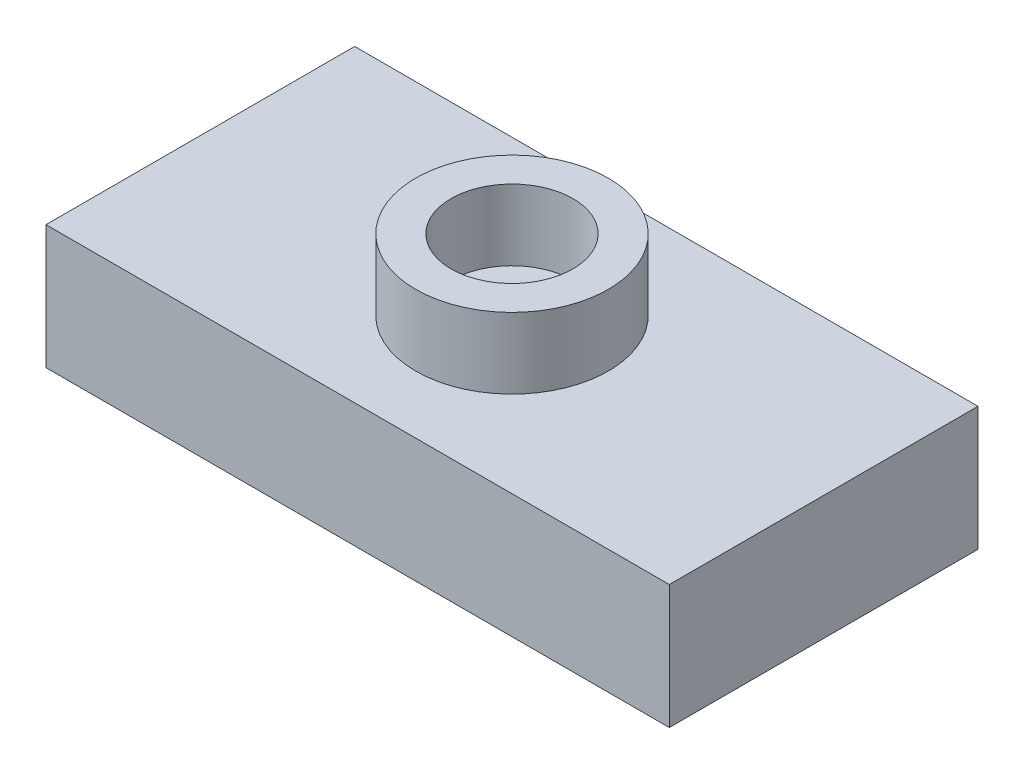
ISO-10303-21;
HEADER;
FILE_DESCRIPTION(('STEP AP214'),'2;1');
FILE_NAME('part.step','',(''),(''),'','','');
FILE_SCHEMA(('AUTOMOTIVE_DESIGN { 1 0 10303 214 1 1 1 1 }'));
ENDSEC;
DATA;
#1=APPLICATION_CONTEXT('core data for automotive mechanical design processes');
#2=APPLICATION_PROTOCOL_DEFINITION('international standard','automotive_design',2000,#1);
#3=PRODUCT_CONTEXT('',#1,'mechanical');
#4=PRODUCT('Part','Part','',(#3));
#5=PRODUCT_RELATED_PRODUCT_CATEGORY('part','',(#4));
#6=PRODUCT_DEFINITION_FORMATION('','',#4);
#7=PRODUCT_DEFINITION_CONTEXT('part definition',#1,'design');
#8=PRODUCT_DEFINITION('design','',#6,#7);
#9=PRODUCT_DEFINITION_SHAPE('','',#8);
#10=(LENGTH_UNIT() NAMED_UNIT(*) SI_UNIT(.MILLI.,.METRE.));
#11=(NAMED_UNIT(*) PLANE_ANGLE_UNIT() SI_UNIT($,.RADIAN.));
#12=(NAMED_UNIT(*) SI_UNIT($,.STERADIAN.) SOLID_ANGLE_UNIT());
#13=UNCERTAINTY_MEASURE_WITH_UNIT(LENGTH_MEASURE(1.E-05),#10,'distance_accuracy_value','');
#14=(GEOMETRIC_REPRESENTATION_CONTEXT(3) GLOBAL_UNCERTAINTY_ASSIGNED_CONTEXT((#13)) GLOBAL_UNIT_ASSIGNED_CONTEXT((#10,
#11,#12)) REPRESENTATION_CONTEXT('',''));
#15=CARTESIAN_POINT('',(0.,0.,0.));
#16=DIRECTION('',(0.,0.,1.));
#17=DIRECTION('',(1.,0.,0.));
#18=AXIS2_PLACEMENT_3D('',#15,#16,#17);
#19=CARTESIAN_POINT('',(7.925,-3.15,-3.925));
#20=DIRECTION('',(1.,0.,0.));
#21=DIRECTION('',(0.,0.,-1.));
#22=AXIS2_PLACEMENT_3D('',#19,#20,#21);
#23=PLANE('',#22);
#24=DIRECTION('',(0.,0.,-1.));
#25=VECTOR('',#24,1.);
#26=CARTESIAN_POINT('',(7.925,0.,-3.925));
#27=LINE('',#26,#25);
#28=CARTESIAN_POINT('',(7.925,0.,3.925));
#29=VERTEX_POINT('',#28);
#30=CARTESIAN_POINT('',(7.925,0.,-3.925));
#31=VERTEX_POINT('',#30);
#32=EDGE_CURVE('E115',#29,#31,#27,.T.);
#33=ORIENTED_EDGE('',*,*,#32,.F.);
#34=DIRECTION('',(0.,1.,0.));
#35=VECTOR('',#34,1.);
#36=CARTESIAN_POINT('',(7.925,-3.15,3.925));
#37=LINE('',#36,#35);
#38=CARTESIAN_POINT('',(7.925,-3.15,3.925));
#39=VERTEX_POINT('',#38);
#40=EDGE_CURVE('E40',#39,#29,#37,.T.);
#41=ORIENTED_EDGE('',*,*,#40,.F.);
#42=DIRECTION('',(0.,0.,-1.));
#43=VECTOR('',#42,1.);
#44=CARTESIAN_POINT('',(7.925,-3.15,-3.925));
#45=LINE('',#44,#43);
#46=CARTESIAN_POINT('',(7.925,-3.15,-3.925));
#47=VERTEX_POINT('',#46);
#48=EDGE_CURVE('E147',#39,#47,#45,.T.);
#49=ORIENTED_EDGE('',*,*,#48,.T.);
#50=DIRECTION('',(0.,1.,0.));
#51=VECTOR('',#50,1.);
#52=CARTESIAN_POINT('',(7.925,-3.15,-3.925));
#53=LINE('',#52,#51);
#54=EDGE_CURVE('E81',#47,#31,#53,.T.);
#55=ORIENTED_EDGE('',*,*,#54,.T.);
#56=EDGE_LOOP('',(#33,#41,#49,#55));
#57=FACE_BOUND('',#56,.T.);
#58=ADVANCED_FACE('F33',(#57),#23,.T.);
#59=CARTESIAN_POINT('',(-7.925,-3.15,3.925));
#60=DIRECTION('',(0.,0.,1.));
#61=DIRECTION('',(1.,0.,0.));
#62=AXIS2_PLACEMENT_3D('',#59,#60,#61);
#63=PLANE('',#62);
#64=DIRECTION('',(1.,0.,0.));
#65=VECTOR('',#64,1.);
#66=CARTESIAN_POINT('',(-7.925,0.,3.925));
#67=LINE('',#66,#65);
#68=CARTESIAN_POINT('',(-7.925,0.,3.925));
#69=VERTEX_POINT('',#68);
#70=EDGE_CURVE('E150',#69,#29,#67,.T.);
#71=ORIENTED_EDGE('',*,*,#70,.F.);
#72=DIRECTION('',(0.,1.,0.));
#73=VECTOR('',#72,1.);
#74=CARTESIAN_POINT('',(-7.925,-3.15,3.925));
#75=LINE('',#74,#73);
#76=CARTESIAN_POINT('',(-7.925,-3.15,3.925));
#77=VERTEX_POINT('',#76);
#78=EDGE_CURVE('E168',#77,#69,#75,.T.);
#79=ORIENTED_EDGE('',*,*,#78,.F.);
#80=DIRECTION('',(1.,0.,0.));
#81=VECTOR('',#80,1.);
#82=CARTESIAN_POINT('',(-7.925,-3.15,3.925));
#83=LINE('',#82,#81);
#84=EDGE_CURVE('E155',#77,#39,#83,.T.);
#85=ORIENTED_EDGE('',*,*,#84,.T.);
#86=ORIENTED_EDGE('',*,*,#40,.T.);
#87=EDGE_LOOP('',(#71,#79,#85,#86));
#88=FACE_BOUND('',#87,.T.);
#89=ADVANCED_FACE('F175',(#88),#63,.T.);
#90=CARTESIAN_POINT('',(-7.925,-3.15,-3.925));
#91=DIRECTION('',(-1.,0.,0.));
#92=DIRECTION('',(0.,0.,1.));
#93=AXIS2_PLACEMENT_3D('',#90,#91,#92);
#94=PLANE('',#93);
#95=DIRECTION('',(0.,0.,1.));
#96=VECTOR('',#95,1.);
#97=CARTESIAN_POINT('',(-7.925,0.,-3.925));
#98=LINE('',#97,#96);
#99=CARTESIAN_POINT('',(-7.925,0.,-3.925));
#100=VERTEX_POINT('',#99);
#101=EDGE_CURVE('E162',#100,#69,#98,.T.);
#102=ORIENTED_EDGE('',*,*,#101,.F.);
#103=DIRECTION('',(0.,1.,0.));
#104=VECTOR('',#103,1.);
#105=CARTESIAN_POINT('',(-7.925,-3.15,-3.925));
#106=LINE('',#105,#104);
#107=CARTESIAN_POINT('',(-7.925,-3.15,-3.925));
#108=VERTEX_POINT('',#107);
#109=EDGE_CURVE('E170',#108,#100,#106,.T.);
#110=ORIENTED_EDGE('',*,*,#109,.F.);
#111=DIRECTION('',(0.,0.,1.));
#112=VECTOR('',#111,1.);
#113=CARTESIAN_POINT('',(-7.925,-3.15,-3.925));
#114=LINE('',#113,#112);
#115=EDGE_CURVE('E152',#108,#77,#114,.T.);
#116=ORIENTED_EDGE('',*,*,#115,.T.);
#117=ORIENTED_EDGE('',*,*,#78,.T.);
#118=EDGE_LOOP('',(#102,#110,#116,#117));
#119=FACE_BOUND('',#118,.T.);
#120=ADVANCED_FACE('F179',(#119),#94,.T.);
#121=CARTESIAN_POINT('',(-7.925,-3.15,-3.925));
#122=DIRECTION('',(0.,0.,-1.));
#123=DIRECTION('',(-1.,0.,0.));
#124=AXIS2_PLACEMENT_3D('',#121,#122,#123);
#125=PLANE('',#124);
#126=DIRECTION('',(-1.,0.,0.));
#127=VECTOR('',#126,1.);
#128=CARTESIAN_POINT('',(-7.925,0.,-3.925));
#129=LINE('',#128,#127);
#130=EDGE_CURVE('E159',#31,#100,#129,.T.);
#131=ORIENTED_EDGE('',*,*,#130,.F.);
#132=ORIENTED_EDGE('',*,*,#54,.F.);
#133=DIRECTION('',(-1.,0.,0.));
#134=VECTOR('',#133,1.);
#135=CARTESIAN_POINT('',(-7.925,-3.15,-3.925));
#136=LINE('',#135,#134);
#137=EDGE_CURVE('E149',#47,#108,#136,.T.);
#138=ORIENTED_EDGE('',*,*,#137,.T.);
#139=ORIENTED_EDGE('',*,*,#109,.T.);
#140=EDGE_LOOP('',(#131,#132,#138,#139));
#141=FACE_BOUND('',#140,.T.);
#142=ADVANCED_FACE('F171',(#141),#125,.T.);
#143=CARTESIAN_POINT('',(0.,-3.15,0.));
#144=DIRECTION('',(0.,1.,0.));
#145=DIRECTION('',(0.,0.,1.));
#146=AXIS2_PLACEMENT_3D('',#143,#144,#145);
#147=PLANE('',#146);
#148=DIRECTION('',(1.,0.,0.));
#149=VECTOR('',#148,1.);
#150=CARTESIAN_POINT('',(0.,-3.15,2.425));
#151=LINE('',#150,#149);
#152=CARTESIAN_POINT('',(-6.425,-3.15,2.425));
#153=VERTEX_POINT('',#152);
#154=CARTESIAN_POINT('',(6.425,-3.15,2.425));
#155=VERTEX_POINT('',#154);
#156=EDGE_CURVE('E142',#153,#155,#151,.T.);
#157=ORIENTED_EDGE('',*,*,#156,.T.);
#158=DIRECTION('',(0.,0.,-1.));
#159=VECTOR('',#158,1.);
#160=CARTESIAN_POINT('',(6.425,-3.15,0.));
#161=LINE('',#160,#159);
#162=CARTESIAN_POINT('',(6.425,-3.15,-2.425));
#163=VERTEX_POINT('',#162);
#164=EDGE_CURVE('E110',#155,#163,#161,.T.);
#165=ORIENTED_EDGE('',*,*,#164,.T.);
#166=DIRECTION('',(-1.,0.,0.));
#167=VECTOR('',#166,1.);
#168=CARTESIAN_POINT('',(0.,-3.15,-2.425));
#169=LINE('',#168,#167);
#170=CARTESIAN_POINT('',(-6.425,-3.15,-2.425));
#171=VERTEX_POINT('',#170);
#172=EDGE_CURVE('E132',#163,#171,#169,.T.);
#173=ORIENTED_EDGE('',*,*,#172,.T.);
#174=DIRECTION('',(0.,0.,1.));
#175=VECTOR('',#174,1.);
#176=CARTESIAN_POINT('',(-6.425,-3.15,0.));
#177=LINE('',#176,#175);
#178=EDGE_CURVE('E47',#171,#153,#177,.T.);
#179=ORIENTED_EDGE('',*,*,#178,.T.);
#180=EDGE_LOOP('',(#157,#165,#173,#179));
#181=FACE_BOUND('',#180,.T.);
#182=ORIENTED_EDGE('',*,*,#48,.F.);
#183=ORIENTED_EDGE('',*,*,#84,.F.);
#184=ORIENTED_EDGE('',*,*,#115,.F.);
#185=ORIENTED_EDGE('',*,*,#137,.F.);
#186=EDGE_LOOP('',(#182,#183,#184,#185));
#187=FACE_BOUND('',#186,.T.);
#188=ADVANCED_FACE('F181',(#181,#187),#147,.F.);
#189=CARTESIAN_POINT('',(0.,0.,0.));
#190=DIRECTION('',(0.,1.,0.));
#191=DIRECTION('',(0.,0.,1.));
#192=AXIS2_PLACEMENT_3D('',#189,#190,#191);
#193=PLANE('',#192);
#194=CARTESIAN_POINT('',(0.,0.,0.));
#195=DIRECTION('',(0.,1.,0.));
#196=DIRECTION('',(0.,0.,1.));
#197=AXIS2_PLACEMENT_3D('',#194,#195,#196);
#198=CIRCLE('',#197,2.45);
#199=CARTESIAN_POINT('',(0.,0.,2.45));
#200=VERTEX_POINT('',#199);
#201=EDGE_CURVE('E308',#200,#200,#198,.T.);
#202=ORIENTED_EDGE('',*,*,#201,.F.);
#203=EDGE_LOOP('',(#202));
#204=FACE_BOUND('',#203,.T.);
#205=ORIENTED_EDGE('',*,*,#32,.T.);
#206=ORIENTED_EDGE('',*,*,#130,.T.);
#207=ORIENTED_EDGE('',*,*,#101,.T.);
#208=ORIENTED_EDGE('',*,*,#70,.T.);
#209=EDGE_LOOP('',(#205,#206,#207,#208));
#210=FACE_BOUND('',#209,.T.);
#211=ADVANCED_FACE('F174',(#204,#210),#193,.T.);
#212=CARTESIAN_POINT('',(6.425,-3.15,-3.925));
#213=DIRECTION('',(1.,0.,0.));
#214=DIRECTION('',(0.,0.,-1.));
#215=AXIS2_PLACEMENT_3D('',#212,#213,#214);
#216=PLANE('',#215);
#217=DIRECTION('',(0.,0.,-1.));
#218=VECTOR('',#217,1.);
#219=CARTESIAN_POINT('',(6.425,-1.5,0.));
#220=LINE('',#219,#218);
#221=CARTESIAN_POINT('',(6.425,-1.5,2.425));
#222=VERTEX_POINT('',#221);
#223=CARTESIAN_POINT('',(6.425,-1.5,-2.425));
#224=VERTEX_POINT('',#223);
#225=EDGE_CURVE('E108',#222,#224,#220,.T.);
#226=ORIENTED_EDGE('',*,*,#225,.T.);
#227=DIRECTION('',(0.,1.,0.));
#228=VECTOR('',#227,1.);
#229=CARTESIAN_POINT('',(6.425,-3.15,-2.425));
#230=LINE('',#229,#228);
#231=EDGE_CURVE('E137',#163,#224,#230,.T.);
#232=ORIENTED_EDGE('',*,*,#231,.F.);
#233=ORIENTED_EDGE('',*,*,#164,.F.);
#234=DIRECTION('',(0.,1.,0.));
#235=VECTOR('',#234,1.);
#236=CARTESIAN_POINT('',(6.425,-3.15,2.425));
#237=LINE('',#236,#235);
#238=EDGE_CURVE('E105',#155,#222,#237,.T.);
#239=ORIENTED_EDGE('',*,*,#238,.T.);
#240=EDGE_LOOP('',(#226,#232,#233,#239));
#241=FACE_BOUND('',#240,.T.);
#242=ADVANCED_FACE('F107',(#241),#216,.F.);
#243=CARTESIAN_POINT('',(-7.925,-3.15,2.425));
#244=DIRECTION('',(0.,0.,1.));
#245=DIRECTION('',(1.,0.,0.));
#246=AXIS2_PLACEMENT_3D('',#243,#244,#245);
#247=PLANE('',#246);
#248=DIRECTION('',(1.,0.,0.));
#249=VECTOR('',#248,1.);
#250=CARTESIAN_POINT('',(0.,-1.5,2.425));
#251=LINE('',#250,#249);
#252=CARTESIAN_POINT('',(-6.425,-1.5,2.425));
#253=VERTEX_POINT('',#252);
#254=EDGE_CURVE('E123',#253,#222,#251,.T.);
#255=ORIENTED_EDGE('',*,*,#254,.T.);
#256=ORIENTED_EDGE('',*,*,#238,.F.);
#257=ORIENTED_EDGE('',*,*,#156,.F.);
#258=DIRECTION('',(0.,1.,0.));
#259=VECTOR('',#258,1.);
#260=CARTESIAN_POINT('',(-6.425,-3.15,2.425));
#261=LINE('',#260,#259);
#262=EDGE_CURVE('E116',#153,#253,#261,.T.);
#263=ORIENTED_EDGE('',*,*,#262,.T.);
#264=EDGE_LOOP('',(#255,#256,#257,#263));
#265=FACE_BOUND('',#264,.T.);
#266=ADVANCED_FACE('F128',(#265),#247,.F.);
#267=CARTESIAN_POINT('',(-6.425,-3.15,-3.925));
#268=DIRECTION('',(-1.,0.,0.));
#269=DIRECTION('',(0.,0.,1.));
#270=AXIS2_PLACEMENT_3D('',#267,#268,#269);
#271=PLANE('',#270);
#272=DIRECTION('',(0.,0.,1.));
#273=VECTOR('',#272,1.);
#274=CARTESIAN_POINT('',(-6.425,-1.5,0.));
#275=LINE('',#274,#273);
#276=CARTESIAN_POINT('',(-6.425,-1.5,-2.425));
#277=VERTEX_POINT('',#276);
#278=EDGE_CURVE('E130',#277,#253,#275,.T.);
#279=ORIENTED_EDGE('',*,*,#278,.T.);
#280=ORIENTED_EDGE('',*,*,#262,.F.);
#281=ORIENTED_EDGE('',*,*,#178,.F.);
#282=DIRECTION('',(0.,1.,0.));
#283=VECTOR('',#282,1.);
#284=CARTESIAN_POINT('',(-6.425,-3.15,-2.425));
#285=LINE('',#284,#283);
#286=EDGE_CURVE('E138',#171,#277,#285,.T.);
#287=ORIENTED_EDGE('',*,*,#286,.T.);
#288=EDGE_LOOP('',(#279,#280,#281,#287));
#289=FACE_BOUND('',#288,.T.);
#290=ADVANCED_FACE('F230',(#289),#271,.F.);
#291=CARTESIAN_POINT('',(-7.925,-3.15,-2.425));
#292=DIRECTION('',(0.,0.,-1.));
#293=DIRECTION('',(-1.,0.,0.));
#294=AXIS2_PLACEMENT_3D('',#291,#292,#293);
#295=PLANE('',#294);
#296=DIRECTION('',(-1.,0.,0.));
#297=VECTOR('',#296,1.);
#298=CARTESIAN_POINT('',(0.,-1.5,-2.425));
#299=LINE('',#298,#297);
#300=EDGE_CURVE('E125',#224,#277,#299,.T.);
#301=ORIENTED_EDGE('',*,*,#300,.T.);
#302=ORIENTED_EDGE('',*,*,#286,.F.);
#303=ORIENTED_EDGE('',*,*,#172,.F.);
#304=ORIENTED_EDGE('',*,*,#231,.T.);
#305=EDGE_LOOP('',(#301,#302,#303,#304));
#306=FACE_BOUND('',#305,.T.);
#307=ADVANCED_FACE('F239',(#306),#295,.F.);
#308=CARTESIAN_POINT('',(0.,-1.5,0.));
#309=DIRECTION('',(0.,1.,0.));
#310=DIRECTION('',(0.,0.,1.));
#311=AXIS2_PLACEMENT_3D('',#308,#309,#310);
#312=PLANE('',#311);
#313=ORIENTED_EDGE('',*,*,#225,.F.);
#314=ORIENTED_EDGE('',*,*,#254,.F.);
#315=ORIENTED_EDGE('',*,*,#278,.F.);
#316=ORIENTED_EDGE('',*,*,#300,.F.);
#317=EDGE_LOOP('',(#313,#314,#315,#316));
#318=FACE_BOUND('',#317,.T.);
#319=ADVANCED_FACE('F121',(#318),#312,.F.);
#320=CARTESIAN_POINT('',(0.,1.8,0.));
#321=DIRECTION('',(0.,1.,0.));
#322=DIRECTION('',(0.,0.,1.));
#323=AXIS2_PLACEMENT_3D('',#320,#321,#322);
#324=PLANE('',#323);
#325=CARTESIAN_POINT('',(0.,1.8,0.));
#326=DIRECTION('',(0.,1.,0.));
#327=DIRECTION('',(0.,0.,1.));
#328=AXIS2_PLACEMENT_3D('',#325,#326,#327);
#329=CIRCLE('',#328,2.45);
#330=CARTESIAN_POINT('',(0.,1.8,2.45));
#331=VERTEX_POINT('',#330);
#332=EDGE_CURVE('E126',#331,#331,#329,.T.);
#333=ORIENTED_EDGE('',*,*,#332,.T.);
#334=EDGE_LOOP('',(#333));
#335=FACE_BOUND('',#334,.T.);
#336=CARTESIAN_POINT('',(0.,1.8,0.));
#337=DIRECTION('',(0.,1.,0.));
#338=DIRECTION('',(0.,0.,1.));
#339=AXIS2_PLACEMENT_3D('',#336,#337,#338);
#340=CIRCLE('',#339,1.55);
#341=CARTESIAN_POINT('',(0.,1.8,1.55));
#342=VERTEX_POINT('',#341);
#343=EDGE_CURVE('E306',#342,#342,#340,.T.);
#344=ORIENTED_EDGE('',*,*,#343,.F.);
#345=EDGE_LOOP('',(#344));
#346=FACE_BOUND('',#345,.T.);
#347=ADVANCED_FACE('F257',(#335,#346),#324,.T.);
#348=CARTESIAN_POINT('',(0.,1.8,0.));
#349=DIRECTION('',(0.,-1.,0.));
#350=DIRECTION('',(0.,0.,-1.));
#351=AXIS2_PLACEMENT_3D('',#348,#349,#350);
#352=CYLINDRICAL_SURFACE('',#351,2.45);
#353=ORIENTED_EDGE('',*,*,#332,.F.);
#354=EDGE_LOOP('',(#353));
#355=FACE_BOUND('',#354,.T.);
#356=ORIENTED_EDGE('',*,*,#201,.T.);
#357=EDGE_LOOP('',(#356));
#358=FACE_BOUND('',#357,.T.);
#359=ADVANCED_FACE('F271',(#355,#358),#352,.T.);
#360=CARTESIAN_POINT('',(0.,1.8,0.));
#361=DIRECTION('',(0.,-1.,0.));
#362=DIRECTION('',(0.,0.,-1.));
#363=AXIS2_PLACEMENT_3D('',#360,#361,#362);
#364=CYLINDRICAL_SURFACE('',#363,1.55);
#365=ORIENTED_EDGE('',*,*,#343,.T.);
#366=EDGE_LOOP('',(#365));
#367=FACE_BOUND('',#366,.T.);
#368=CARTESIAN_POINT('',(0.,0.,0.));
#369=DIRECTION('',(0.,1.,0.));
#370=DIRECTION('',(0.,0.,1.));
#371=AXIS2_PLACEMENT_3D('',#368,#369,#370);
#372=CIRCLE('',#371,1.55);
#373=CARTESIAN_POINT('',(0.,0.,1.55));
#374=VERTEX_POINT('',#373);
#375=EDGE_CURVE('E11',#374,#374,#372,.F.);
#376=ORIENTED_EDGE('',*,*,#375,.T.);
#377=EDGE_LOOP('',(#376));
#378=FACE_BOUND('',#377,.T.);
#379=ADVANCED_FACE('F281',(#367,#378),#364,.F.);
#380=ORIENTED_EDGE('',*,*,#375,.F.);
#381=EDGE_LOOP('',(#380));
#382=FACE_BOUND('',#381,.T.);
#383=ADVANCED_FACE('F191',(#382),#193,.T.);
#384=CLOSED_SHELL('',(#58,#89,#120,#142,#188,#211,#242,#266,#290,#307,#319,#347,#359,#379,#383));
#385=MANIFOLD_SOLID_BREP('B2',#384);
#386=ADVANCED_BREP_SHAPE_REPRESENTATION('',(#18,#385),#14);
#387=SHAPE_DEFINITION_REPRESENTATION(#9,#386);
ENDSEC;
END-ISO-10303-21;
